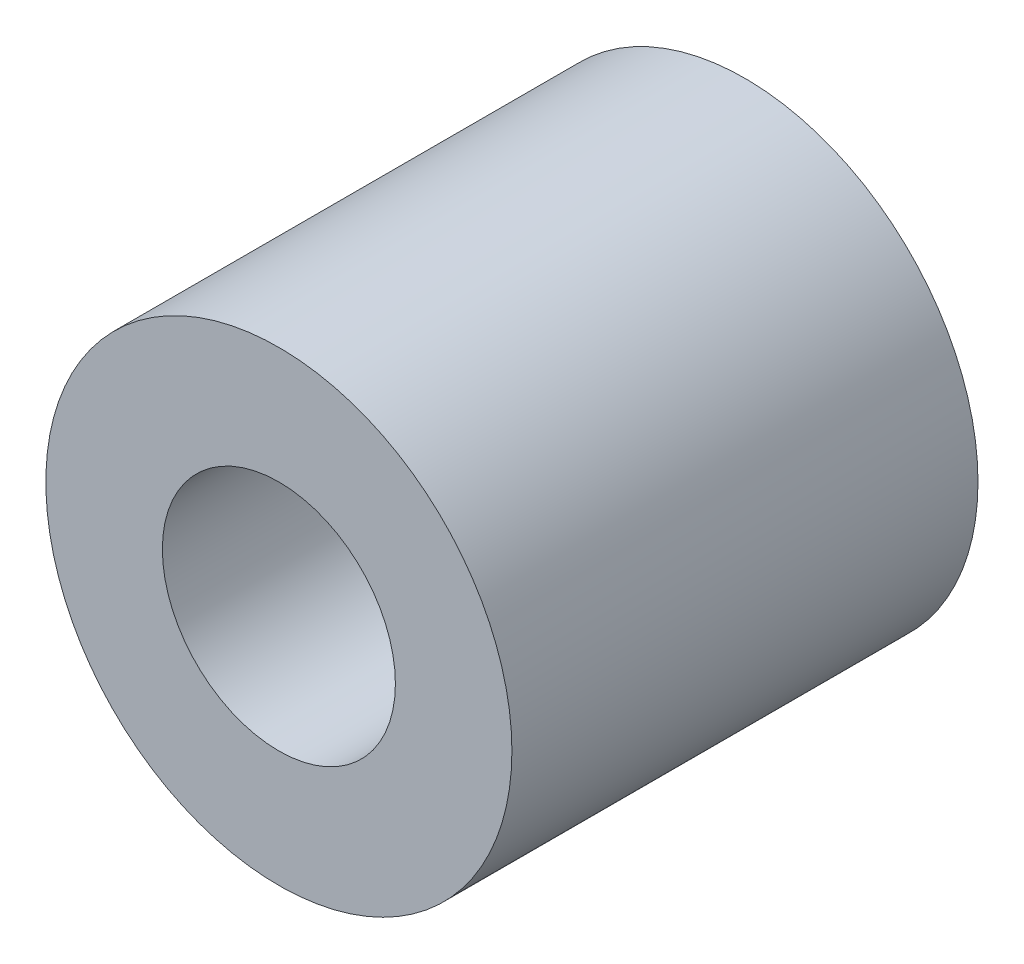
ISO-10303-21;
HEADER;
FILE_DESCRIPTION(('STEP AP214'),'2;1');
FILE_NAME('part.step','',(''),(''),'','','');
FILE_SCHEMA(('AUTOMOTIVE_DESIGN { 1 0 10303 214 1 1 1 1 }'));
ENDSEC;
DATA;
#1=APPLICATION_CONTEXT('core data for automotive mechanical design processes');
#2=APPLICATION_PROTOCOL_DEFINITION('international standard','automotive_design',2000,#1);
#3=PRODUCT_CONTEXT('',#1,'mechanical');
#4=PRODUCT('Part','Part','',(#3));
#5=PRODUCT_RELATED_PRODUCT_CATEGORY('part','',(#4));
#6=PRODUCT_DEFINITION_FORMATION('','',#4);
#7=PRODUCT_DEFINITION_CONTEXT('part definition',#1,'design');
#8=PRODUCT_DEFINITION('design','',#6,#7);
#9=PRODUCT_DEFINITION_SHAPE('','',#8);
#10=(LENGTH_UNIT() NAMED_UNIT(*) SI_UNIT(.MILLI.,.METRE.));
#11=(NAMED_UNIT(*) PLANE_ANGLE_UNIT() SI_UNIT($,.RADIAN.));
#12=(NAMED_UNIT(*) SI_UNIT($,.STERADIAN.) SOLID_ANGLE_UNIT());
#13=UNCERTAINTY_MEASURE_WITH_UNIT(LENGTH_MEASURE(1.E-05),#10,'distance_accuracy_value','');
#14=(GEOMETRIC_REPRESENTATION_CONTEXT(3) GLOBAL_UNCERTAINTY_ASSIGNED_CONTEXT((#13)) GLOBAL_UNIT_ASSIGNED_CONTEXT((#10,
#11,#12)) REPRESENTATION_CONTEXT('',''));
#15=CARTESIAN_POINT('',(0.,0.,0.));
#16=DIRECTION('',(0.,0.,1.));
#17=DIRECTION('',(1.,0.,0.));
#18=AXIS2_PLACEMENT_3D('',#15,#16,#17);
#19=CARTESIAN_POINT('',(0.,0.,3.));
#20=DIRECTION('',(0.,0.,1.));
#21=DIRECTION('',(1.,0.,0.));
#22=AXIS2_PLACEMENT_3D('',#19,#20,#21);
#23=PLANE('',#22);
#24=CARTESIAN_POINT('',(0.,0.,3.));
#25=DIRECTION('',(0.,0.,1.));
#26=DIRECTION('',(1.,0.,0.));
#27=AXIS2_PLACEMENT_3D('',#24,#25,#26);
#28=CIRCLE('',#27,3.);
#29=CARTESIAN_POINT('',(3.,0.,3.));
#30=VERTEX_POINT('',#29);
#31=EDGE_CURVE('E10',#30,#30,#28,.T.);
#32=ORIENTED_EDGE('',*,*,#31,.T.);
#33=EDGE_LOOP('',(#32));
#34=FACE_BOUND('',#33,.T.);
#35=CARTESIAN_POINT('',(0.,0.,3.));
#36=DIRECTION('',(0.,0.,1.));
#37=DIRECTION('',(1.,0.,0.));
#38=AXIS2_PLACEMENT_3D('',#35,#36,#37);
#39=CIRCLE('',#38,1.5);
#40=CARTESIAN_POINT('',(1.5,0.,3.));
#41=VERTEX_POINT('',#40);
#42=EDGE_CURVE('E44',#41,#41,#39,.T.);
#43=ORIENTED_EDGE('',*,*,#42,.F.);
#44=EDGE_LOOP('',(#43));
#45=FACE_BOUND('',#44,.T.);
#46=ADVANCED_FACE('F33',(#34,#45),#23,.T.);
#47=CARTESIAN_POINT('',(0.,0.,-3.));
#48=DIRECTION('',(0.,0.,1.));
#49=DIRECTION('',(1.,0.,0.));
#50=AXIS2_PLACEMENT_3D('',#47,#48,#49);
#51=PLANE('',#50);
#52=CARTESIAN_POINT('',(0.,0.,-3.));
#53=DIRECTION('',(0.,0.,1.));
#54=DIRECTION('',(1.,0.,0.));
#55=AXIS2_PLACEMENT_3D('',#52,#53,#54);
#56=CIRCLE('',#55,3.);
#57=CARTESIAN_POINT('',(3.,0.,-3.));
#58=VERTEX_POINT('',#57);
#59=EDGE_CURVE('E37',#58,#58,#56,.T.);
#60=ORIENTED_EDGE('',*,*,#59,.F.);
#61=EDGE_LOOP('',(#60));
#62=FACE_BOUND('',#61,.T.);
#63=CARTESIAN_POINT('',(0.,0.,-3.));
#64=DIRECTION('',(0.,0.,1.));
#65=DIRECTION('',(1.,0.,0.));
#66=AXIS2_PLACEMENT_3D('',#63,#64,#65);
#67=CIRCLE('',#66,1.5);
#68=CARTESIAN_POINT('',(1.5,0.,-3.));
#69=VERTEX_POINT('',#68);
#70=EDGE_CURVE('E46',#69,#69,#67,.T.);
#71=ORIENTED_EDGE('',*,*,#70,.T.);
#72=EDGE_LOOP('',(#71));
#73=FACE_BOUND('',#72,.T.);
#74=ADVANCED_FACE('F56',(#62,#73),#51,.F.);
#75=CARTESIAN_POINT('',(0.,0.,3.));
#76=DIRECTION('',(0.,0.,-1.));
#77=DIRECTION('',(-1.,0.,0.));
#78=AXIS2_PLACEMENT_3D('',#75,#76,#77);
#79=CYLINDRICAL_SURFACE('',#78,3.);
#80=ORIENTED_EDGE('',*,*,#31,.F.);
#81=EDGE_LOOP('',(#80));
#82=FACE_BOUND('',#81,.T.);
#83=ORIENTED_EDGE('',*,*,#59,.T.);
#84=EDGE_LOOP('',(#83));
#85=FACE_BOUND('',#84,.T.);
#86=ADVANCED_FACE('F35',(#82,#85),#79,.T.);
#87=CARTESIAN_POINT('',(0.,0.,3.));
#88=DIRECTION('',(0.,0.,-1.));
#89=DIRECTION('',(-1.,0.,0.));
#90=AXIS2_PLACEMENT_3D('',#87,#88,#89);
#91=CYLINDRICAL_SURFACE('',#90,1.5);
#92=ORIENTED_EDGE('',*,*,#42,.T.);
#93=EDGE_LOOP('',(#92));
#94=FACE_BOUND('',#93,.T.);
#95=ORIENTED_EDGE('',*,*,#70,.F.);
#96=EDGE_LOOP('',(#95));
#97=FACE_BOUND('',#96,.T.);
#98=ADVANCED_FACE('F52',(#94,#97),#91,.F.);
#99=CLOSED_SHELL('',(#46,#74,#86,#98));
#100=MANIFOLD_SOLID_BREP('B2',#99);
#101=ADVANCED_BREP_SHAPE_REPRESENTATION('',(#18,#100),#14);
#102=SHAPE_DEFINITION_REPRESENTATION(#9,#101);
ENDSEC;
END-ISO-10303-21;
